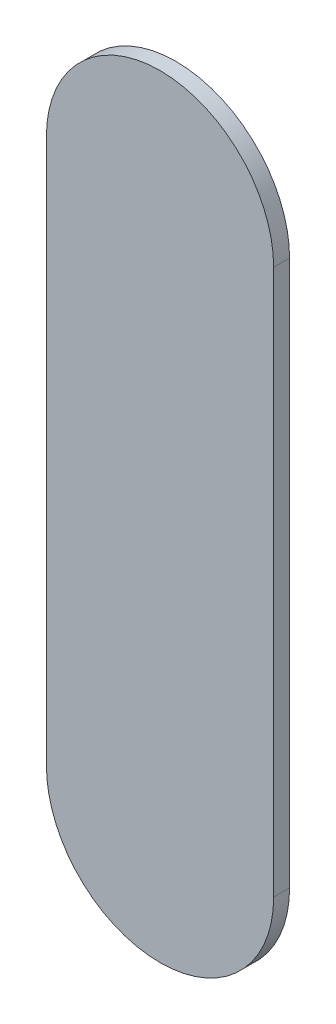
ISO-10303-21;
HEADER;
FILE_DESCRIPTION(('STEP AP214'),'2;1');
FILE_NAME('part.step','',(''),(''),'','','');
FILE_SCHEMA(('AUTOMOTIVE_DESIGN { 1 0 10303 214 1 1 1 1 }'));
ENDSEC;
DATA;
#1=APPLICATION_CONTEXT('core data for automotive mechanical design processes');
#2=APPLICATION_PROTOCOL_DEFINITION('international standard','automotive_design',2000,#1);
#3=PRODUCT_CONTEXT('',#1,'mechanical');
#4=PRODUCT('Part','Part','',(#3));
#5=PRODUCT_RELATED_PRODUCT_CATEGORY('part','',(#4));
#6=PRODUCT_DEFINITION_FORMATION('','',#4);
#7=PRODUCT_DEFINITION_CONTEXT('part definition',#1,'design');
#8=PRODUCT_DEFINITION('design','',#6,#7);
#9=PRODUCT_DEFINITION_SHAPE('','',#8);
#10=(LENGTH_UNIT() NAMED_UNIT(*) SI_UNIT(.MILLI.,.METRE.));
#11=(NAMED_UNIT(*) PLANE_ANGLE_UNIT() SI_UNIT($,.RADIAN.));
#12=(NAMED_UNIT(*) SI_UNIT($,.STERADIAN.) SOLID_ANGLE_UNIT());
#13=UNCERTAINTY_MEASURE_WITH_UNIT(LENGTH_MEASURE(1.E-05),#10,'distance_accuracy_value','');
#14=(GEOMETRIC_REPRESENTATION_CONTEXT(3) GLOBAL_UNCERTAINTY_ASSIGNED_CONTEXT((#13)) GLOBAL_UNIT_ASSIGNED_CONTEXT((#10,
#11,#12)) REPRESENTATION_CONTEXT('',''));
#15=CARTESIAN_POINT('',(0.,0.,0.));
#16=DIRECTION('',(0.,0.,1.));
#17=DIRECTION('',(1.,0.,0.));
#18=AXIS2_PLACEMENT_3D('',#15,#16,#17);
#19=CARTESIAN_POINT('',(83.875,-122.625,1.635));
#20=DIRECTION('',(0.,0.,1.));
#21=DIRECTION('',(1.,0.,0.));
#22=AXIS2_PLACEMENT_3D('',#19,#20,#21);
#23=PLANE('',#22);
#24=DIRECTION('',(0.,-1.,0.));
#25=VECTOR('',#24,1.);
#26=CARTESIAN_POINT('',(83.875,-122.625,1.635));
#27=LINE('',#26,#25);
#28=CARTESIAN_POINT('',(83.875,-122.625,1.635));
#29=VERTEX_POINT('',#28);
#30=CARTESIAN_POINT('',(83.875,-123.825,1.635));
#31=VERTEX_POINT('',#30);
#32=EDGE_CURVE('E80',#29,#31,#27,.T.);
#33=ORIENTED_EDGE('',*,*,#32,.T.);
#34=CARTESIAN_POINT('',(84.125,-123.825,1.635));
#35=DIRECTION('',(0.,0.,1.));
#36=DIRECTION('',(-1.,0.,0.));
#37=AXIS2_PLACEMENT_3D('',#34,#35,#36);
#38=CIRCLE('',#37,0.25);
#39=CARTESIAN_POINT('',(84.375,-123.825,1.635));
#40=VERTEX_POINT('',#39);
#41=EDGE_CURVE('E106',#31,#40,#38,.T.);
#42=ORIENTED_EDGE('',*,*,#41,.T.);
#43=DIRECTION('',(0.,1.,0.));
#44=VECTOR('',#43,1.);
#45=CARTESIAN_POINT('',(84.375,-123.825,1.635));
#46=LINE('',#45,#44);
#47=CARTESIAN_POINT('',(84.375,-122.625,1.635));
#48=VERTEX_POINT('',#47);
#49=EDGE_CURVE('E73',#40,#48,#46,.T.);
#50=ORIENTED_EDGE('',*,*,#49,.T.);
#51=CARTESIAN_POINT('',(84.125,-122.625,1.635));
#52=DIRECTION('',(0.,0.,1.));
#53=DIRECTION('',(1.,0.,0.));
#54=AXIS2_PLACEMENT_3D('',#51,#52,#53);
#55=CIRCLE('',#54,0.25);
#56=EDGE_CURVE('E11',#48,#29,#55,.T.);
#57=ORIENTED_EDGE('',*,*,#56,.T.);
#58=EDGE_LOOP('',(#33,#42,#50,#57));
#59=FACE_BOUND('',#58,.T.);
#60=ADVANCED_FACE('F17',(#59),#23,.T.);
#61=CARTESIAN_POINT('',(83.875,-122.625,1.6));
#62=DIRECTION('',(0.,0.,1.));
#63=DIRECTION('',(1.,0.,0.));
#64=AXIS2_PLACEMENT_3D('',#61,#62,#63);
#65=PLANE('',#64);
#66=CARTESIAN_POINT('',(84.125,-122.625,1.6));
#67=DIRECTION('',(0.,0.,1.));
#68=DIRECTION('',(1.,0.,0.));
#69=AXIS2_PLACEMENT_3D('',#66,#67,#68);
#70=CIRCLE('',#69,0.25);
#71=CARTESIAN_POINT('',(84.375,-122.625,1.6));
#72=VERTEX_POINT('',#71);
#73=CARTESIAN_POINT('',(83.875,-122.625,1.6));
#74=VERTEX_POINT('',#73);
#75=EDGE_CURVE('E20',#72,#74,#70,.T.);
#76=ORIENTED_EDGE('',*,*,#75,.F.);
#77=DIRECTION('',(0.,1.,0.));
#78=VECTOR('',#77,1.);
#79=CARTESIAN_POINT('',(84.375,-123.825,1.6));
#80=LINE('',#79,#78);
#81=CARTESIAN_POINT('',(84.375,-123.825,1.6));
#82=VERTEX_POINT('',#81);
#83=EDGE_CURVE('E110',#82,#72,#80,.T.);
#84=ORIENTED_EDGE('',*,*,#83,.F.);
#85=CARTESIAN_POINT('',(84.125,-123.825,1.6));
#86=DIRECTION('',(0.,0.,1.));
#87=DIRECTION('',(-1.,0.,0.));
#88=AXIS2_PLACEMENT_3D('',#85,#86,#87);
#89=CIRCLE('',#88,0.25);
#90=CARTESIAN_POINT('',(83.875,-123.825,1.6));
#91=VERTEX_POINT('',#90);
#92=EDGE_CURVE('E82',#91,#82,#89,.T.);
#93=ORIENTED_EDGE('',*,*,#92,.F.);
#94=DIRECTION('',(0.,-1.,0.));
#95=VECTOR('',#94,1.);
#96=CARTESIAN_POINT('',(83.875,-122.625,1.6));
#97=LINE('',#96,#95);
#98=EDGE_CURVE('E78',#74,#91,#97,.T.);
#99=ORIENTED_EDGE('',*,*,#98,.F.);
#100=EDGE_LOOP('',(#76,#84,#93,#99));
#101=FACE_BOUND('',#100,.T.);
#102=ADVANCED_FACE('F84',(#101),#65,.F.);
#103=CARTESIAN_POINT('',(84.125,-122.625,1.6));
#104=DIRECTION('',(0.,0.,-1.));
#105=DIRECTION('',(1.,0.,0.));
#106=AXIS2_PLACEMENT_3D('',#103,#104,#105);
#107=CYLINDRICAL_SURFACE('',#106,0.25);
#108=ORIENTED_EDGE('',*,*,#75,.T.);
#109=DIRECTION('',(0.,0.,1.));
#110=VECTOR('',#109,1.);
#111=CARTESIAN_POINT('',(83.875,-122.625,1.6));
#112=LINE('',#111,#110);
#113=EDGE_CURVE('E65',#74,#29,#112,.T.);
#114=ORIENTED_EDGE('',*,*,#113,.T.);
#115=ORIENTED_EDGE('',*,*,#56,.F.);
#116=DIRECTION('',(0.,0.,1.));
#117=VECTOR('',#116,1.);
#118=CARTESIAN_POINT('',(84.375,-122.625,1.6));
#119=LINE('',#118,#117);
#120=EDGE_CURVE('E68',#72,#48,#119,.T.);
#121=ORIENTED_EDGE('',*,*,#120,.F.);
#122=EDGE_LOOP('',(#108,#114,#115,#121));
#123=FACE_BOUND('',#122,.T.);
#124=ADVANCED_FACE('F64',(#123),#107,.T.);
#125=CARTESIAN_POINT('',(84.375,-123.825,1.6));
#126=DIRECTION('',(-1.,0.,0.));
#127=DIRECTION('',(0.,0.,1.));
#128=AXIS2_PLACEMENT_3D('',#125,#126,#127);
#129=PLANE('',#128);
#130=ORIENTED_EDGE('',*,*,#83,.T.);
#131=ORIENTED_EDGE('',*,*,#120,.T.);
#132=ORIENTED_EDGE('',*,*,#49,.F.);
#133=DIRECTION('',(0.,0.,1.));
#134=VECTOR('',#133,1.);
#135=CARTESIAN_POINT('',(84.375,-123.825,1.6));
#136=LINE('',#135,#134);
#137=EDGE_CURVE('E102',#82,#40,#136,.T.);
#138=ORIENTED_EDGE('',*,*,#137,.F.);
#139=EDGE_LOOP('',(#130,#131,#132,#138));
#140=FACE_BOUND('',#139,.T.);
#141=ADVANCED_FACE('F117',(#140),#129,.F.);
#142=CARTESIAN_POINT('',(84.125,-123.825,1.6));
#143=DIRECTION('',(0.,0.,-1.));
#144=DIRECTION('',(-1.,0.,0.));
#145=AXIS2_PLACEMENT_3D('',#142,#143,#144);
#146=CYLINDRICAL_SURFACE('',#145,0.25);
#147=ORIENTED_EDGE('',*,*,#92,.T.);
#148=ORIENTED_EDGE('',*,*,#137,.T.);
#149=ORIENTED_EDGE('',*,*,#41,.F.);
#150=DIRECTION('',(0.,0.,1.));
#151=VECTOR('',#150,1.);
#152=CARTESIAN_POINT('',(83.875,-123.825,1.6));
#153=LINE('',#152,#151);
#154=EDGE_CURVE('E88',#91,#31,#153,.T.);
#155=ORIENTED_EDGE('',*,*,#154,.F.);
#156=EDGE_LOOP('',(#147,#148,#149,#155));
#157=FACE_BOUND('',#156,.T.);
#158=ADVANCED_FACE('F119',(#157),#146,.T.);
#159=CARTESIAN_POINT('',(83.875,-122.625,1.6));
#160=DIRECTION('',(1.,0.,0.));
#161=DIRECTION('',(0.,1.,0.));
#162=AXIS2_PLACEMENT_3D('',#159,#160,#161);
#163=PLANE('',#162);
#164=ORIENTED_EDGE('',*,*,#98,.T.);
#165=ORIENTED_EDGE('',*,*,#154,.T.);
#166=ORIENTED_EDGE('',*,*,#32,.F.);
#167=ORIENTED_EDGE('',*,*,#113,.F.);
#168=EDGE_LOOP('',(#164,#165,#166,#167));
#169=FACE_BOUND('',#168,.T.);
#170=ADVANCED_FACE('F76',(#169),#163,.F.);
#171=CLOSED_SHELL('',(#60,#102,#124,#141,#158,#170));
#172=MANIFOLD_SOLID_BREP('B1',#171);
#173=ADVANCED_BREP_SHAPE_REPRESENTATION('',(#18,#172),#14);
#174=SHAPE_DEFINITION_REPRESENTATION(#9,#173);
ENDSEC;
END-ISO-10303-21;
